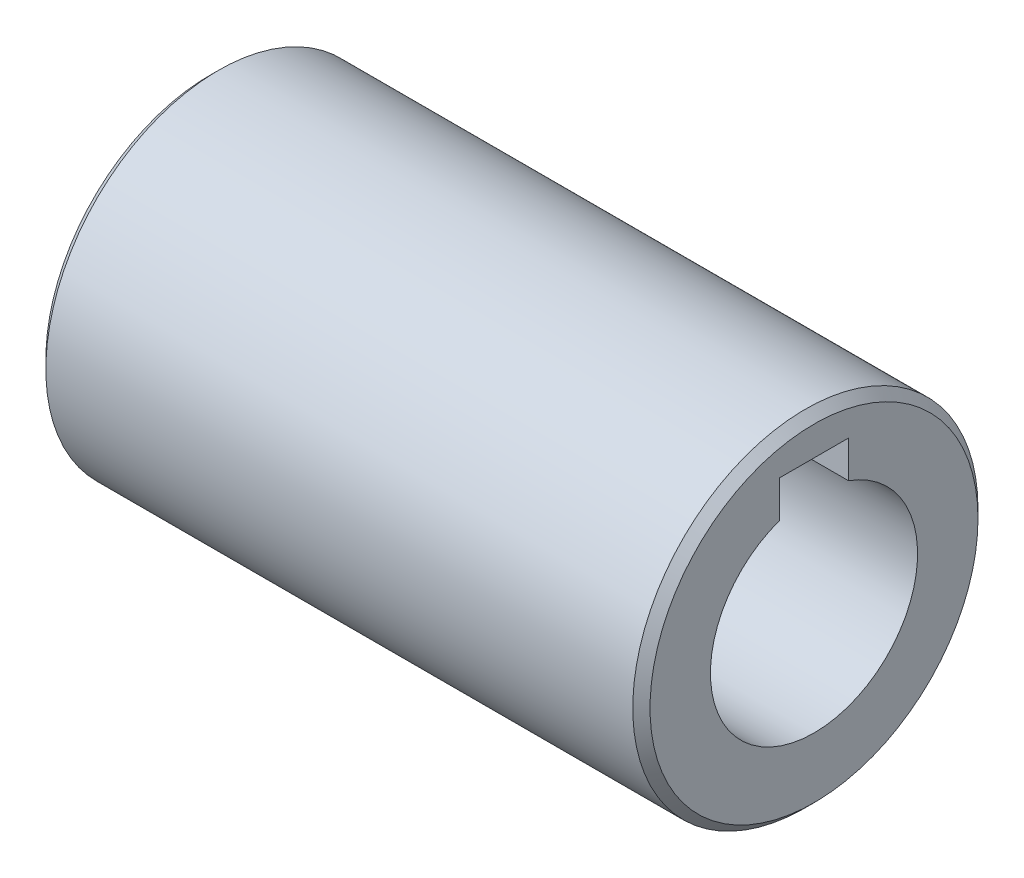
ISO-10303-21;
HEADER;
FILE_DESCRIPTION(('STEP AP214'),'2;1');
FILE_NAME('part.step','',(''),(''),'','','');
FILE_SCHEMA(('AUTOMOTIVE_DESIGN { 1 0 10303 214 1 1 1 1 }'));
ENDSEC;
DATA;
#1=APPLICATION_CONTEXT('core data for automotive mechanical design processes');
#2=APPLICATION_PROTOCOL_DEFINITION('international standard','automotive_design',2000,#1);
#3=PRODUCT_CONTEXT('',#1,'mechanical');
#4=PRODUCT('Part','Part','',(#3));
#5=PRODUCT_RELATED_PRODUCT_CATEGORY('part','',(#4));
#6=PRODUCT_DEFINITION_FORMATION('','',#4);
#7=PRODUCT_DEFINITION_CONTEXT('part definition',#1,'design');
#8=PRODUCT_DEFINITION('design','',#6,#7);
#9=PRODUCT_DEFINITION_SHAPE('','',#8);
#10=(LENGTH_UNIT() NAMED_UNIT(*) SI_UNIT(.MILLI.,.METRE.));
#11=(NAMED_UNIT(*) PLANE_ANGLE_UNIT() SI_UNIT($,.RADIAN.));
#12=(NAMED_UNIT(*) SI_UNIT($,.STERADIAN.) SOLID_ANGLE_UNIT());
#13=UNCERTAINTY_MEASURE_WITH_UNIT(LENGTH_MEASURE(1.E-05),#10,'distance_accuracy_value','');
#14=(GEOMETRIC_REPRESENTATION_CONTEXT(3) GLOBAL_UNCERTAINTY_ASSIGNED_CONTEXT((#13)) GLOBAL_UNIT_ASSIGNED_CONTEXT((#10,
#11,#12)) REPRESENTATION_CONTEXT('',''));
#15=CARTESIAN_POINT('',(0.,0.,0.));
#16=DIRECTION('',(0.,0.,1.));
#17=DIRECTION('',(1.,0.,0.));
#18=AXIS2_PLACEMENT_3D('',#15,#16,#17);
#19=CARTESIAN_POINT('',(35.,0.,0.));
#20=DIRECTION('',(1.,0.,0.));
#21=DIRECTION('',(0.,0.,-1.));
#22=AXIS2_PLACEMENT_3D('',#19,#20,#21);
#23=PLANE('',#22);
#24=CARTESIAN_POINT('',(35.,0.,0.));
#25=DIRECTION('',(1.,0.,0.));
#26=DIRECTION('',(0.,0.,-1.));
#27=AXIS2_PLACEMENT_3D('',#24,#25,#26);
#28=CIRCLE('',#27,9.49999999999999);
#29=CARTESIAN_POINT('',(35.,0.,-9.49999999999999));
#30=VERTEX_POINT('',#29);
#31=EDGE_CURVE('E11',#30,#30,#28,.T.);
#32=ORIENTED_EDGE('',*,*,#31,.T.);
#33=EDGE_LOOP('',(#32));
#34=FACE_BOUND('',#33,.T.);
#35=DIRECTION('',(0.,-1.,0.));
#36=VECTOR('',#35,1.);
#37=CARTESIAN_POINT('',(35.,7.8,-2.));
#38=LINE('',#37,#36);
#39=CARTESIAN_POINT('',(35.,7.8,-2.));
#40=VERTEX_POINT('',#39);
#41=CARTESIAN_POINT('',(35.,5.65685424949238,-2.));
#42=VERTEX_POINT('',#41);
#43=EDGE_CURVE('E101',#40,#42,#38,.T.);
#44=ORIENTED_EDGE('',*,*,#43,.T.);
#45=CARTESIAN_POINT('',(35.,0.,0.));
#46=DIRECTION('',(1.,0.,0.));
#47=DIRECTION('',(0.,0.,-1.));
#48=AXIS2_PLACEMENT_3D('',#45,#46,#47);
#49=CIRCLE('',#48,6.);
#50=CARTESIAN_POINT('',(35.,5.65685424949238,2.));
#51=VERTEX_POINT('',#50);
#52=EDGE_CURVE('E99',#51,#42,#49,.T.);
#53=ORIENTED_EDGE('',*,*,#52,.F.);
#54=DIRECTION('',(0.,1.,0.));
#55=VECTOR('',#54,1.);
#56=CARTESIAN_POINT('',(35.,7.8,2.));
#57=LINE('',#56,#55);
#58=CARTESIAN_POINT('',(35.,7.8,2.));
#59=VERTEX_POINT('',#58);
#60=EDGE_CURVE('E55',#51,#59,#57,.T.);
#61=ORIENTED_EDGE('',*,*,#60,.T.);
#62=DIRECTION('',(0.,0.,-1.));
#63=VECTOR('',#62,1.);
#64=CARTESIAN_POINT('',(35.,7.8,-2.));
#65=LINE('',#64,#63);
#66=EDGE_CURVE('E90',#59,#40,#65,.T.);
#67=ORIENTED_EDGE('',*,*,#66,.T.);
#68=EDGE_LOOP('',(#44,#53,#61,#67));
#69=FACE_BOUND('',#68,.T.);
#70=ADVANCED_FACE('F39',(#34,#69),#23,.T.);
#71=CARTESIAN_POINT('',(0.,0.,0.));
#72=DIRECTION('',(1.,0.,0.));
#73=DIRECTION('',(0.,0.,-1.));
#74=AXIS2_PLACEMENT_3D('',#71,#72,#73);
#75=PLANE('',#74);
#76=CARTESIAN_POINT('',(0.,0.,0.));
#77=DIRECTION('',(1.,0.,0.));
#78=DIRECTION('',(0.,0.,-1.));
#79=AXIS2_PLACEMENT_3D('',#76,#77,#78);
#80=CIRCLE('',#79,9.49999999999999);
#81=CARTESIAN_POINT('',(0.,0.,-9.49999999999999));
#82=VERTEX_POINT('',#81);
#83=EDGE_CURVE('E48',#82,#82,#80,.F.);
#84=ORIENTED_EDGE('',*,*,#83,.T.);
#85=EDGE_LOOP('',(#84));
#86=FACE_BOUND('',#85,.T.);
#87=CARTESIAN_POINT('',(0.,0.,0.));
#88=DIRECTION('',(1.,0.,0.));
#89=DIRECTION('',(0.,0.,-1.));
#90=AXIS2_PLACEMENT_3D('',#87,#88,#89);
#91=CIRCLE('',#90,6.);
#92=CARTESIAN_POINT('',(0.,5.65685424949238,2.));
#93=VERTEX_POINT('',#92);
#94=CARTESIAN_POINT('',(0.,5.65685424949238,-2.));
#95=VERTEX_POINT('',#94);
#96=EDGE_CURVE('E115',#93,#95,#91,.T.);
#97=ORIENTED_EDGE('',*,*,#96,.T.);
#98=DIRECTION('',(0.,-1.,0.));
#99=VECTOR('',#98,1.);
#100=CARTESIAN_POINT('',(0.,7.8,-2.));
#101=LINE('',#100,#99);
#102=CARTESIAN_POINT('',(0.,7.8,-2.));
#103=VERTEX_POINT('',#102);
#104=EDGE_CURVE('E107',#103,#95,#101,.T.);
#105=ORIENTED_EDGE('',*,*,#104,.F.);
#106=DIRECTION('',(0.,0.,-1.));
#107=VECTOR('',#106,1.);
#108=CARTESIAN_POINT('',(0.,7.8,-2.));
#109=LINE('',#108,#107);
#110=CARTESIAN_POINT('',(0.,7.8,2.));
#111=VERTEX_POINT('',#110);
#112=EDGE_CURVE('E104',#111,#103,#109,.T.);
#113=ORIENTED_EDGE('',*,*,#112,.F.);
#114=DIRECTION('',(0.,1.,0.));
#115=VECTOR('',#114,1.);
#116=CARTESIAN_POINT('',(0.,7.8,2.));
#117=LINE('',#116,#115);
#118=EDGE_CURVE('E84',#93,#111,#117,.T.);
#119=ORIENTED_EDGE('',*,*,#118,.F.);
#120=EDGE_LOOP('',(#97,#105,#113,#119));
#121=FACE_BOUND('',#120,.T.);
#122=ADVANCED_FACE('F138',(#86,#121),#75,.F.);
#123=CARTESIAN_POINT('',(35.,0.,0.));
#124=DIRECTION('',(-1.,0.,0.));
#125=DIRECTION('',(0.,0.,1.));
#126=AXIS2_PLACEMENT_3D('',#123,#124,#125);
#127=CYLINDRICAL_SURFACE('',#126,10.);
#128=CARTESIAN_POINT('',(0.500000000000014,0.,0.));
#129=DIRECTION('',(1.,0.,0.));
#130=DIRECTION('',(0.,0.,-1.));
#131=AXIS2_PLACEMENT_3D('',#128,#129,#130);
#132=CIRCLE('',#131,10.);
#133=CARTESIAN_POINT('',(0.500000000000014,0.,-10.));
#134=VERTEX_POINT('',#133);
#135=EDGE_CURVE('E131',#134,#134,#132,.T.);
#136=ORIENTED_EDGE('',*,*,#135,.T.);
#137=EDGE_LOOP('',(#136));
#138=FACE_BOUND('',#137,.T.);
#139=CARTESIAN_POINT('',(34.5,0.,0.));
#140=DIRECTION('',(1.,0.,0.));
#141=DIRECTION('',(0.,0.,-1.));
#142=AXIS2_PLACEMENT_3D('',#139,#140,#141);
#143=CIRCLE('',#142,10.);
#144=CARTESIAN_POINT('',(34.5,0.,-10.));
#145=VERTEX_POINT('',#144);
#146=EDGE_CURVE('E127',#145,#145,#143,.F.);
#147=ORIENTED_EDGE('',*,*,#146,.T.);
#148=EDGE_LOOP('',(#147));
#149=FACE_BOUND('',#148,.T.);
#150=ADVANCED_FACE('F146',(#138,#149),#127,.T.);
#151=CARTESIAN_POINT('',(35.,0.,0.));
#152=DIRECTION('',(-1.,0.,0.));
#153=DIRECTION('',(0.,0.,1.));
#154=AXIS2_PLACEMENT_3D('',#151,#152,#153);
#155=CYLINDRICAL_SURFACE('',#154,6.);
#156=DIRECTION('',(-1.,0.,0.));
#157=VECTOR('',#156,1.);
#158=CARTESIAN_POINT('',(35.,5.65685424949238,-2.));
#159=LINE('',#158,#157);
#160=EDGE_CURVE('E63',#95,#42,#159,.F.);
#161=ORIENTED_EDGE('',*,*,#160,.F.);
#162=ORIENTED_EDGE('',*,*,#96,.F.);
#163=DIRECTION('',(-1.,0.,0.));
#164=VECTOR('',#163,1.);
#165=CARTESIAN_POINT('',(35.,5.65685424949238,2.));
#166=LINE('',#165,#164);
#167=EDGE_CURVE('E119',#51,#93,#166,.T.);
#168=ORIENTED_EDGE('',*,*,#167,.F.);
#169=ORIENTED_EDGE('',*,*,#52,.T.);
#170=EDGE_LOOP('',(#161,#162,#168,#169));
#171=FACE_BOUND('',#170,.T.);
#172=ADVANCED_FACE('F149',(#171),#155,.F.);
#173=CARTESIAN_POINT('',(35.,7.8,-2.));
#174=DIRECTION('',(0.,0.,-1.));
#175=DIRECTION('',(0.,1.,0.));
#176=AXIS2_PLACEMENT_3D('',#173,#174,#175);
#177=PLANE('',#176);
#178=ORIENTED_EDGE('',*,*,#160,.T.);
#179=ORIENTED_EDGE('',*,*,#43,.F.);
#180=DIRECTION('',(-1.,0.,0.));
#181=VECTOR('',#180,1.);
#182=CARTESIAN_POINT('',(35.,7.8,-2.));
#183=LINE('',#182,#181);
#184=EDGE_CURVE('E89',#40,#103,#183,.T.);
#185=ORIENTED_EDGE('',*,*,#184,.T.);
#186=ORIENTED_EDGE('',*,*,#104,.T.);
#187=EDGE_LOOP('',(#178,#179,#185,#186));
#188=FACE_BOUND('',#187,.T.);
#189=ADVANCED_FACE('F167',(#188),#177,.F.);
#190=CARTESIAN_POINT('',(35.,7.8,-2.));
#191=DIRECTION('',(0.,1.,0.));
#192=DIRECTION('',(0.,0.,1.));
#193=AXIS2_PLACEMENT_3D('',#190,#191,#192);
#194=PLANE('',#193);
#195=ORIENTED_EDGE('',*,*,#112,.T.);
#196=ORIENTED_EDGE('',*,*,#184,.F.);
#197=ORIENTED_EDGE('',*,*,#66,.F.);
#198=DIRECTION('',(-1.,0.,0.));
#199=VECTOR('',#198,1.);
#200=CARTESIAN_POINT('',(35.,7.8,2.));
#201=LINE('',#200,#199);
#202=EDGE_CURVE('E80',#59,#111,#201,.T.);
#203=ORIENTED_EDGE('',*,*,#202,.T.);
#204=EDGE_LOOP('',(#195,#196,#197,#203));
#205=FACE_BOUND('',#204,.T.);
#206=ADVANCED_FACE('F93',(#205),#194,.F.);
#207=CARTESIAN_POINT('',(35.,7.8,2.));
#208=DIRECTION('',(0.,0.,1.));
#209=DIRECTION('',(0.,-1.,0.));
#210=AXIS2_PLACEMENT_3D('',#207,#208,#209);
#211=PLANE('',#210);
#212=ORIENTED_EDGE('',*,*,#167,.T.);
#213=ORIENTED_EDGE('',*,*,#118,.T.);
#214=ORIENTED_EDGE('',*,*,#202,.F.);
#215=ORIENTED_EDGE('',*,*,#60,.F.);
#216=EDGE_LOOP('',(#212,#213,#214,#215));
#217=FACE_BOUND('',#216,.T.);
#218=ADVANCED_FACE('F82',(#217),#211,.F.);
#219=CARTESIAN_POINT('',(0.500000000000014,0.,0.));
#220=DIRECTION('',(1.,0.,0.));
#221=DIRECTION('',(0.,0.,-1.));
#222=AXIS2_PLACEMENT_3D('',#219,#220,#221);
#223=CONICAL_SURFACE('',#222,10.,0.785398163397447);
#224=ORIENTED_EDGE('',*,*,#83,.F.);
#225=EDGE_LOOP('',(#224));
#226=FACE_BOUND('',#225,.T.);
#227=ORIENTED_EDGE('',*,*,#135,.F.);
#228=EDGE_LOOP('',(#227));
#229=FACE_BOUND('',#228,.T.);
#230=ADVANCED_FACE('F141',(#226,#229),#223,.T.);
#231=CARTESIAN_POINT('',(35.,0.,0.));
#232=DIRECTION('',(-1.,0.,0.));
#233=DIRECTION('',(0.,0.,1.));
#234=AXIS2_PLACEMENT_3D('',#231,#232,#233);
#235=CONICAL_SURFACE('',#234,9.49999999999999,0.785398163397447);
#236=ORIENTED_EDGE('',*,*,#146,.F.);
#237=EDGE_LOOP('',(#236));
#238=FACE_BOUND('',#237,.T.);
#239=ORIENTED_EDGE('',*,*,#31,.F.);
#240=EDGE_LOOP('',(#239));
#241=FACE_BOUND('',#240,.T.);
#242=ADVANCED_FACE('F41',(#238,#241),#235,.T.);
#243=CLOSED_SHELL('',(#70,#122,#150,#172,#189,#206,#218,#230,#242));
#244=MANIFOLD_SOLID_BREP('B2',#243);
#245=ADVANCED_BREP_SHAPE_REPRESENTATION('',(#18,#244),#14);
#246=SHAPE_DEFINITION_REPRESENTATION(#9,#245);
ENDSEC;
END-ISO-10303-21;
